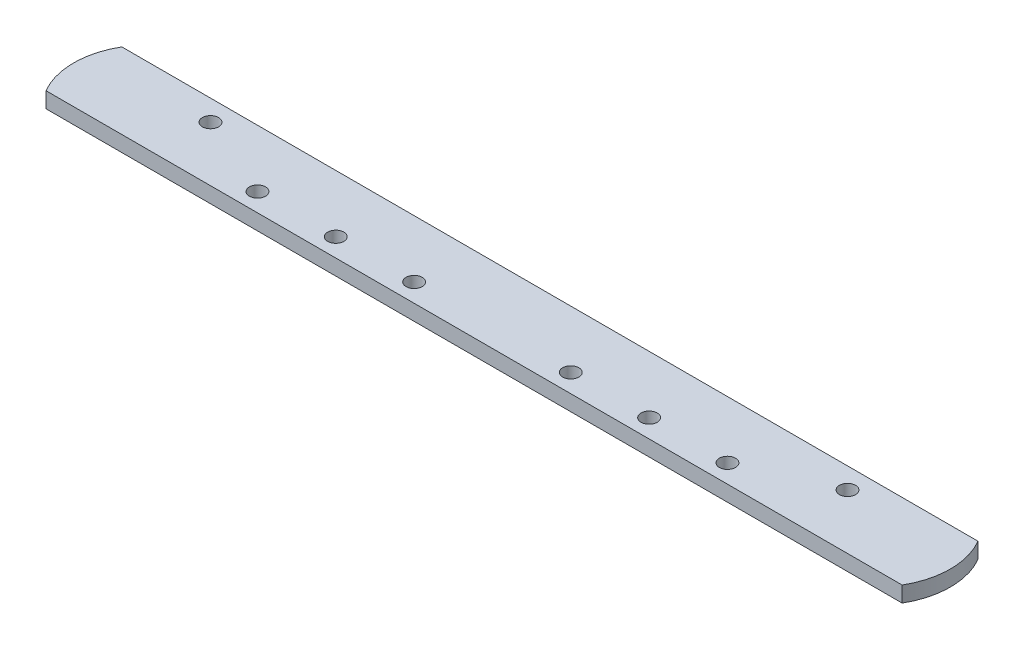
ISO-10303-21;
HEADER;
FILE_DESCRIPTION(('STEP AP214'),'2;1');
FILE_NAME('part.step','',(''),(''),'','','');
FILE_SCHEMA(('AUTOMOTIVE_DESIGN { 1 0 10303 214 1 1 1 1 }'));
ENDSEC;
DATA;
#1=APPLICATION_CONTEXT('core data for automotive mechanical design processes');
#2=APPLICATION_PROTOCOL_DEFINITION('international standard','automotive_design',2000,#1);
#3=PRODUCT_CONTEXT('',#1,'mechanical');
#4=PRODUCT('Part','Part','',(#3));
#5=PRODUCT_RELATED_PRODUCT_CATEGORY('part','',(#4));
#6=PRODUCT_DEFINITION_FORMATION('','',#4);
#7=PRODUCT_DEFINITION_CONTEXT('part definition',#1,'design');
#8=PRODUCT_DEFINITION('design','',#6,#7);
#9=PRODUCT_DEFINITION_SHAPE('','',#8);
#10=(LENGTH_UNIT() NAMED_UNIT(*) SI_UNIT(.MILLI.,.METRE.));
#11=(NAMED_UNIT(*) PLANE_ANGLE_UNIT() SI_UNIT($,.RADIAN.));
#12=(NAMED_UNIT(*) SI_UNIT($,.STERADIAN.) SOLID_ANGLE_UNIT());
#13=UNCERTAINTY_MEASURE_WITH_UNIT(LENGTH_MEASURE(1.E-05),#10,'distance_accuracy_value','');
#14=(GEOMETRIC_REPRESENTATION_CONTEXT(3) GLOBAL_UNCERTAINTY_ASSIGNED_CONTEXT((#13)) GLOBAL_UNIT_ASSIGNED_CONTEXT((#10,
#11,#12)) REPRESENTATION_CONTEXT('',''));
#15=CARTESIAN_POINT('',(0.,0.,0.));
#16=DIRECTION('',(0.,0.,1.));
#17=DIRECTION('',(1.,0.,0.));
#18=AXIS2_PLACEMENT_3D('',#15,#16,#17);
#19=CARTESIAN_POINT('',(-69.8674785281242,3.,-0.133913791833529));
#20=DIRECTION('',(0.,1.,0.));
#21=DIRECTION('',(0.,0.,1.));
#22=AXIS2_PLACEMENT_3D('',#19,#20,#21);
#23=PLANE('',#22);
#24=CARTESIAN_POINT('',(29.7225158493542,3.,3.60033580579458));
#25=DIRECTION('',(0.,1.,0.));
#26=DIRECTION('',(0.,0.,1.));
#27=AXIS2_PLACEMENT_3D('',#24,#25,#26);
#28=CIRCLE('',#27,1.55);
#29=CARTESIAN_POINT('',(29.7225158493542,3.,5.15033580579458));
#30=VERTEX_POINT('',#29);
#31=EDGE_CURVE('E151',#30,#30,#28,.T.);
#32=ORIENTED_EDGE('',*,*,#31,.F.);
#33=EDGE_LOOP('',(#32));
#34=FACE_BOUND('',#33,.T.);
#35=CARTESIAN_POINT('',(-45.2774841506459,3.,3.60033580579555));
#36=DIRECTION('',(0.,1.,0.));
#37=DIRECTION('',(0.,0.,1.));
#38=AXIS2_PLACEMENT_3D('',#35,#36,#37);
#39=CIRCLE('',#38,1.55);
#40=CARTESIAN_POINT('',(-45.2774841506459,3.,5.15033580579555));
#41=VERTEX_POINT('',#40);
#42=EDGE_CURVE('E139',#41,#41,#39,.T.);
#43=ORIENTED_EDGE('',*,*,#42,.F.);
#44=EDGE_LOOP('',(#43));
#45=FACE_BOUND('',#44,.T.);
#46=CARTESIAN_POINT('',(14.7225158493542,3.,3.60033580579572));
#47=DIRECTION('',(0.,1.,0.));
#48=DIRECTION('',(0.,0.,1.));
#49=AXIS2_PLACEMENT_3D('',#46,#47,#48);
#50=CIRCLE('',#49,1.55);
#51=CARTESIAN_POINT('',(14.7225158493542,3.,5.15033580579572));
#52=VERTEX_POINT('',#51);
#53=EDGE_CURVE('E127',#52,#52,#50,.T.);
#54=ORIENTED_EDGE('',*,*,#53,.F.);
#55=EDGE_LOOP('',(#54));
#56=FACE_BOUND('',#55,.T.);
#57=CARTESIAN_POINT('',(-61.2774841506458,3.,-3.39966419420429));
#58=DIRECTION('',(0.,1.,0.));
#59=DIRECTION('',(0.,0.,1.));
#60=AXIS2_PLACEMENT_3D('',#57,#58,#59);
#61=CIRCLE('',#60,1.55);
#62=CARTESIAN_POINT('',(-61.2774841506458,3.,-1.84966419420429));
#63=VERTEX_POINT('',#62);
#64=EDGE_CURVE('E106',#63,#63,#61,.T.);
#65=ORIENTED_EDGE('',*,*,#64,.F.);
#66=EDGE_LOOP('',(#65));
#67=FACE_BOUND('',#66,.T.);
#68=CARTESIAN_POINT('',(-69.8674785281242,3.,-0.133913791833529));
#69=DIRECTION('',(0.,1.,0.));
#70=DIRECTION('',(0.,0.,1.));
#71=AXIS2_PLACEMENT_3D('',#68,#69,#70);
#72=CIRCLE('',#71,14.3552574405959);
#73=CARTESIAN_POINT('',(-82.2482009333893,3.,-7.39966419420429));
#74=VERTEX_POINT('',#73);
#75=CARTESIAN_POINT('',(-82.2482009333893,3.,7.13183661053718));
#76=VERTEX_POINT('',#75);
#77=EDGE_CURVE('E91',#74,#76,#72,.T.);
#78=ORIENTED_EDGE('',*,*,#77,.T.);
#79=DIRECTION('',(1.,0.,0.));
#80=VECTOR('',#79,1.);
#81=CARTESIAN_POINT('',(81.7125457660552,3.,7.13183661053718));
#82=LINE('',#81,#80);
#83=CARTESIAN_POINT('',(81.7125457660552,3.,7.13183661053718));
#84=VERTEX_POINT('',#83);
#85=EDGE_CURVE('E86',#76,#84,#82,.T.);
#86=ORIENTED_EDGE('',*,*,#85,.T.);
#87=CARTESIAN_POINT('',(69.3318233607901,3.,-0.133913791833529));
#88=DIRECTION('',(0.,1.,0.));
#89=DIRECTION('',(0.,0.,-1.));
#90=AXIS2_PLACEMENT_3D('',#87,#88,#89);
#91=CIRCLE('',#90,14.3552574405959);
#92=CARTESIAN_POINT('',(81.7125457660552,3.,-7.39966419420429));
#93=VERTEX_POINT('',#92);
#94=EDGE_CURVE('E89',#84,#93,#91,.T.);
#95=ORIENTED_EDGE('',*,*,#94,.T.);
#96=DIRECTION('',(-1.,0.,0.));
#97=VECTOR('',#96,1.);
#98=CARTESIAN_POINT('',(-82.2482009333893,3.,-7.39966419420429));
#99=LINE('',#98,#97);
#100=EDGE_CURVE('E56',#93,#74,#99,.T.);
#101=ORIENTED_EDGE('',*,*,#100,.T.);
#102=EDGE_LOOP('',(#78,#86,#95,#101));
#103=FACE_BOUND('',#102,.T.);
#104=CARTESIAN_POINT('',(-15.2774841506458,3.,3.60033580579572));
#105=DIRECTION('',(0.,1.,0.));
#106=DIRECTION('',(0.,0.,1.));
#107=AXIS2_PLACEMENT_3D('',#104,#105,#106);
#108=CIRCLE('',#107,1.55000000000003);
#109=CARTESIAN_POINT('',(-15.2774841506458,3.,5.15033580579575));
#110=VERTEX_POINT('',#109);
#111=EDGE_CURVE('E121',#110,#110,#108,.T.);
#112=ORIENTED_EDGE('',*,*,#111,.F.);
#113=EDGE_LOOP('',(#112));
#114=FACE_BOUND('',#113,.T.);
#115=CARTESIAN_POINT('',(60.7225158493542,3.,-3.39966419420429));
#116=DIRECTION('',(0.,1.,0.));
#117=DIRECTION('',(0.,0.,1.));
#118=AXIS2_PLACEMENT_3D('',#115,#116,#117);
#119=CIRCLE('',#118,1.55);
#120=CARTESIAN_POINT('',(60.7225158493542,3.,-1.84966419420429));
#121=VERTEX_POINT('',#120);
#122=EDGE_CURVE('E133',#121,#121,#119,.T.);
#123=ORIENTED_EDGE('',*,*,#122,.F.);
#124=EDGE_LOOP('',(#123));
#125=FACE_BOUND('',#124,.T.);
#126=CARTESIAN_POINT('',(-30.2774841506458,3.,3.60033580579454));
#127=DIRECTION('',(0.,1.,0.));
#128=DIRECTION('',(0.,0.,1.));
#129=AXIS2_PLACEMENT_3D('',#126,#127,#128);
#130=CIRCLE('',#129,1.55);
#131=CARTESIAN_POINT('',(-30.2774841506458,3.,5.15033580579454));
#132=VERTEX_POINT('',#131);
#133=EDGE_CURVE('E145',#132,#132,#130,.T.);
#134=ORIENTED_EDGE('',*,*,#133,.F.);
#135=EDGE_LOOP('',(#134));
#136=FACE_BOUND('',#135,.T.);
#137=CARTESIAN_POINT('',(44.7225158493541,3.,3.60033580579577));
#138=DIRECTION('',(0.,1.,0.));
#139=DIRECTION('',(0.,0.,1.));
#140=AXIS2_PLACEMENT_3D('',#137,#138,#139);
#141=CIRCLE('',#140,1.55000000000009);
#142=CARTESIAN_POINT('',(44.7225158493541,3.,5.15033580579586));
#143=VERTEX_POINT('',#142);
#144=EDGE_CURVE('E157',#143,#143,#141,.T.);
#145=ORIENTED_EDGE('',*,*,#144,.F.);
#146=EDGE_LOOP('',(#145));
#147=FACE_BOUND('',#146,.T.);
#148=ADVANCED_FACE('F39',(#34,#45,#56,#67,#103,#114,#125,#136,#147),#23,.T.);
#149=CARTESIAN_POINT('',(-69.8674785281242,0.,-0.133913791833529));
#150=DIRECTION('',(0.,1.,0.));
#151=DIRECTION('',(0.,0.,1.));
#152=AXIS2_PLACEMENT_3D('',#149,#150,#151);
#153=PLANE('',#152);
#154=CARTESIAN_POINT('',(-69.8674785281242,0.,-0.133913791833529));
#155=DIRECTION('',(0.,1.,0.));
#156=DIRECTION('',(0.,0.,1.));
#157=AXIS2_PLACEMENT_3D('',#154,#155,#156);
#158=CIRCLE('',#157,14.3552574405959);
#159=CARTESIAN_POINT('',(-82.2482009333893,0.,-7.39966419420429));
#160=VERTEX_POINT('',#159);
#161=CARTESIAN_POINT('',(-82.2482009333893,0.,7.13183661053718));
#162=VERTEX_POINT('',#161);
#163=EDGE_CURVE('E103',#160,#162,#158,.T.);
#164=ORIENTED_EDGE('',*,*,#163,.F.);
#165=DIRECTION('',(-1.,0.,0.));
#166=VECTOR('',#165,1.);
#167=CARTESIAN_POINT('',(-82.2482009333893,0.,-7.39966419420429));
#168=LINE('',#167,#166);
#169=CARTESIAN_POINT('',(81.7125457660552,0.,-7.39966419420429));
#170=VERTEX_POINT('',#169);
#171=EDGE_CURVE('E79',#170,#160,#168,.T.);
#172=ORIENTED_EDGE('',*,*,#171,.F.);
#173=CARTESIAN_POINT('',(69.3318233607901,0.,-0.133913791833529));
#174=DIRECTION('',(0.,1.,0.));
#175=DIRECTION('',(0.,0.,-1.));
#176=AXIS2_PLACEMENT_3D('',#173,#174,#175);
#177=CIRCLE('',#176,14.3552574405959);
#178=CARTESIAN_POINT('',(81.7125457660552,0.,7.13183661053718));
#179=VERTEX_POINT('',#178);
#180=EDGE_CURVE('E73',#179,#170,#177,.T.);
#181=ORIENTED_EDGE('',*,*,#180,.F.);
#182=DIRECTION('',(1.,0.,0.));
#183=VECTOR('',#182,1.);
#184=CARTESIAN_POINT('',(81.7125457660552,0.,7.13183661053718));
#185=LINE('',#184,#183);
#186=EDGE_CURVE('E95',#162,#179,#185,.T.);
#187=ORIENTED_EDGE('',*,*,#186,.F.);
#188=EDGE_LOOP('',(#164,#172,#181,#187));
#189=FACE_BOUND('',#188,.T.);
#190=CARTESIAN_POINT('',(-61.2774841506458,0.,-3.39966419420429));
#191=DIRECTION('',(0.,1.,0.));
#192=DIRECTION('',(0.,0.,1.));
#193=AXIS2_PLACEMENT_3D('',#190,#191,#192);
#194=CIRCLE('',#193,1.55);
#195=CARTESIAN_POINT('',(-61.2774841506458,0.,-1.84966419420429));
#196=VERTEX_POINT('',#195);
#197=EDGE_CURVE('E118',#196,#196,#194,.T.);
#198=ORIENTED_EDGE('',*,*,#197,.T.);
#199=EDGE_LOOP('',(#198));
#200=FACE_BOUND('',#199,.T.);
#201=CARTESIAN_POINT('',(-15.2774841506458,0.,3.60033580579572));
#202=DIRECTION('',(0.,1.,0.));
#203=DIRECTION('',(0.,0.,1.));
#204=AXIS2_PLACEMENT_3D('',#201,#202,#203);
#205=CIRCLE('',#204,1.55000000000003);
#206=CARTESIAN_POINT('',(-15.2774841506458,0.,5.15033580579575));
#207=VERTEX_POINT('',#206);
#208=EDGE_CURVE('E124',#207,#207,#205,.T.);
#209=ORIENTED_EDGE('',*,*,#208,.T.);
#210=EDGE_LOOP('',(#209));
#211=FACE_BOUND('',#210,.T.);
#212=CARTESIAN_POINT('',(14.7225158493542,0.,3.60033580579572));
#213=DIRECTION('',(0.,1.,0.));
#214=DIRECTION('',(0.,0.,1.));
#215=AXIS2_PLACEMENT_3D('',#212,#213,#214);
#216=CIRCLE('',#215,1.55);
#217=CARTESIAN_POINT('',(14.7225158493542,0.,5.15033580579572));
#218=VERTEX_POINT('',#217);
#219=EDGE_CURVE('E130',#218,#218,#216,.T.);
#220=ORIENTED_EDGE('',*,*,#219,.T.);
#221=EDGE_LOOP('',(#220));
#222=FACE_BOUND('',#221,.T.);
#223=CARTESIAN_POINT('',(60.7225158493542,0.,-3.39966419420429));
#224=DIRECTION('',(0.,1.,0.));
#225=DIRECTION('',(0.,0.,1.));
#226=AXIS2_PLACEMENT_3D('',#223,#224,#225);
#227=CIRCLE('',#226,1.55);
#228=CARTESIAN_POINT('',(60.7225158493542,0.,-1.84966419420429));
#229=VERTEX_POINT('',#228);
#230=EDGE_CURVE('E136',#229,#229,#227,.T.);
#231=ORIENTED_EDGE('',*,*,#230,.T.);
#232=EDGE_LOOP('',(#231));
#233=FACE_BOUND('',#232,.T.);
#234=CARTESIAN_POINT('',(-45.2774841506459,0.,3.60033580579555));
#235=DIRECTION('',(0.,1.,0.));
#236=DIRECTION('',(0.,0.,1.));
#237=AXIS2_PLACEMENT_3D('',#234,#235,#236);
#238=CIRCLE('',#237,1.55);
#239=CARTESIAN_POINT('',(-45.2774841506459,0.,5.15033580579555));
#240=VERTEX_POINT('',#239);
#241=EDGE_CURVE('E142',#240,#240,#238,.T.);
#242=ORIENTED_EDGE('',*,*,#241,.T.);
#243=EDGE_LOOP('',(#242));
#244=FACE_BOUND('',#243,.T.);
#245=CARTESIAN_POINT('',(-30.2774841506458,0.,3.60033580579454));
#246=DIRECTION('',(0.,1.,0.));
#247=DIRECTION('',(0.,0.,1.));
#248=AXIS2_PLACEMENT_3D('',#245,#246,#247);
#249=CIRCLE('',#248,1.55);
#250=CARTESIAN_POINT('',(-30.2774841506458,0.,5.15033580579454));
#251=VERTEX_POINT('',#250);
#252=EDGE_CURVE('E148',#251,#251,#249,.T.);
#253=ORIENTED_EDGE('',*,*,#252,.T.);
#254=EDGE_LOOP('',(#253));
#255=FACE_BOUND('',#254,.T.);
#256=CARTESIAN_POINT('',(29.7225158493542,0.,3.60033580579458));
#257=DIRECTION('',(0.,1.,0.));
#258=DIRECTION('',(0.,0.,1.));
#259=AXIS2_PLACEMENT_3D('',#256,#257,#258);
#260=CIRCLE('',#259,1.55);
#261=CARTESIAN_POINT('',(29.7225158493542,0.,5.15033580579458));
#262=VERTEX_POINT('',#261);
#263=EDGE_CURVE('E154',#262,#262,#260,.T.);
#264=ORIENTED_EDGE('',*,*,#263,.T.);
#265=EDGE_LOOP('',(#264));
#266=FACE_BOUND('',#265,.T.);
#267=CARTESIAN_POINT('',(44.7225158493541,0.,3.60033580579577));
#268=DIRECTION('',(0.,1.,0.));
#269=DIRECTION('',(0.,0.,1.));
#270=AXIS2_PLACEMENT_3D('',#267,#268,#269);
#271=CIRCLE('',#270,1.55000000000009);
#272=CARTESIAN_POINT('',(44.7225158493541,0.,5.15033580579586));
#273=VERTEX_POINT('',#272);
#274=EDGE_CURVE('E160',#273,#273,#271,.T.);
#275=ORIENTED_EDGE('',*,*,#274,.T.);
#276=EDGE_LOOP('',(#275));
#277=FACE_BOUND('',#276,.T.);
#278=ADVANCED_FACE('F114',(#189,#200,#211,#222,#233,#244,#255,#266,#277),#153,.F.);
#279=CARTESIAN_POINT('',(-69.8674785281242,3.,-0.133913791833529));
#280=DIRECTION('',(0.,-1.,0.));
#281=DIRECTION('',(0.,0.,-1.));
#282=AXIS2_PLACEMENT_3D('',#279,#280,#281);
#283=CYLINDRICAL_SURFACE('',#282,14.3552574405959);
#284=ORIENTED_EDGE('',*,*,#163,.T.);
#285=DIRECTION('',(0.,-1.,0.));
#286=VECTOR('',#285,1.);
#287=CARTESIAN_POINT('',(-82.2482009333893,3.,7.13183661053718));
#288=LINE('',#287,#286);
#289=EDGE_CURVE('E11',#76,#162,#288,.T.);
#290=ORIENTED_EDGE('',*,*,#289,.F.);
#291=ORIENTED_EDGE('',*,*,#77,.F.);
#292=DIRECTION('',(0.,-1.,0.));
#293=VECTOR('',#292,1.);
#294=CARTESIAN_POINT('',(-82.2482009333893,3.,-7.39966419420429));
#295=LINE('',#294,#293);
#296=EDGE_CURVE('E99',#74,#160,#295,.T.);
#297=ORIENTED_EDGE('',*,*,#296,.T.);
#298=EDGE_LOOP('',(#284,#290,#291,#297));
#299=FACE_BOUND('',#298,.T.);
#300=ADVANCED_FACE('F41',(#299),#283,.T.);
#301=CARTESIAN_POINT('',(81.7125457660552,3.,7.13183661053718));
#302=DIRECTION('',(0.,0.,-1.));
#303=DIRECTION('',(-1.,0.,0.));
#304=AXIS2_PLACEMENT_3D('',#301,#302,#303);
#305=PLANE('',#304);
#306=ORIENTED_EDGE('',*,*,#186,.T.);
#307=DIRECTION('',(0.,-1.,0.));
#308=VECTOR('',#307,1.);
#309=CARTESIAN_POINT('',(81.7125457660552,3.,7.13183661053718));
#310=LINE('',#309,#308);
#311=EDGE_CURVE('E48',#84,#179,#310,.T.);
#312=ORIENTED_EDGE('',*,*,#311,.F.);
#313=ORIENTED_EDGE('',*,*,#85,.F.);
#314=ORIENTED_EDGE('',*,*,#289,.T.);
#315=EDGE_LOOP('',(#306,#312,#313,#314));
#316=FACE_BOUND('',#315,.T.);
#317=ADVANCED_FACE('F94',(#316),#305,.F.);
#318=CARTESIAN_POINT('',(69.3318233607901,3.,-0.133913791833529));
#319=DIRECTION('',(0.,-1.,0.));
#320=DIRECTION('',(0.,0.,-1.));
#321=AXIS2_PLACEMENT_3D('',#318,#319,#320);
#322=CYLINDRICAL_SURFACE('',#321,14.3552574405959);
#323=ORIENTED_EDGE('',*,*,#180,.T.);
#324=DIRECTION('',(0.,-1.,0.));
#325=VECTOR('',#324,1.);
#326=CARTESIAN_POINT('',(81.7125457660552,3.,-7.39966419420429));
#327=LINE('',#326,#325);
#328=EDGE_CURVE('E96',#93,#170,#327,.T.);
#329=ORIENTED_EDGE('',*,*,#328,.F.);
#330=ORIENTED_EDGE('',*,*,#94,.F.);
#331=ORIENTED_EDGE('',*,*,#311,.T.);
#332=EDGE_LOOP('',(#323,#329,#330,#331));
#333=FACE_BOUND('',#332,.T.);
#334=ADVANCED_FACE('F97',(#333),#322,.T.);
#335=CARTESIAN_POINT('',(-82.2482009333893,3.,-7.39966419420429));
#336=DIRECTION('',(0.,0.,1.));
#337=DIRECTION('',(1.,0.,0.));
#338=AXIS2_PLACEMENT_3D('',#335,#336,#337);
#339=PLANE('',#338);
#340=ORIENTED_EDGE('',*,*,#171,.T.);
#341=ORIENTED_EDGE('',*,*,#296,.F.);
#342=ORIENTED_EDGE('',*,*,#100,.F.);
#343=ORIENTED_EDGE('',*,*,#328,.T.);
#344=EDGE_LOOP('',(#340,#341,#342,#343));
#345=FACE_BOUND('',#344,.T.);
#346=ADVANCED_FACE('F111',(#345),#339,.F.);
#347=CARTESIAN_POINT('',(-61.2774841506458,3.,-3.39966419420429));
#348=DIRECTION('',(0.,-1.,0.));
#349=DIRECTION('',(0.,0.,-1.));
#350=AXIS2_PLACEMENT_3D('',#347,#348,#349);
#351=CYLINDRICAL_SURFACE('',#350,1.55);
#352=ORIENTED_EDGE('',*,*,#64,.T.);
#353=EDGE_LOOP('',(#352));
#354=FACE_BOUND('',#353,.T.);
#355=ORIENTED_EDGE('',*,*,#197,.F.);
#356=EDGE_LOOP('',(#355));
#357=FACE_BOUND('',#356,.T.);
#358=ADVANCED_FACE('F179',(#354,#357),#351,.F.);
#359=CARTESIAN_POINT('',(-15.2774841506458,3.,3.60033580579572));
#360=DIRECTION('',(0.,-1.,0.));
#361=DIRECTION('',(0.,0.,-1.));
#362=AXIS2_PLACEMENT_3D('',#359,#360,#361);
#363=CYLINDRICAL_SURFACE('',#362,1.55000000000003);
#364=ORIENTED_EDGE('',*,*,#111,.T.);
#365=EDGE_LOOP('',(#364));
#366=FACE_BOUND('',#365,.T.);
#367=ORIENTED_EDGE('',*,*,#208,.F.);
#368=EDGE_LOOP('',(#367));
#369=FACE_BOUND('',#368,.T.);
#370=ADVANCED_FACE('F233',(#366,#369),#363,.F.);
#371=CARTESIAN_POINT('',(14.7225158493542,3.,3.60033580579572));
#372=DIRECTION('',(0.,-1.,0.));
#373=DIRECTION('',(0.,0.,-1.));
#374=AXIS2_PLACEMENT_3D('',#371,#372,#373);
#375=CYLINDRICAL_SURFACE('',#374,1.55);
#376=ORIENTED_EDGE('',*,*,#53,.T.);
#377=EDGE_LOOP('',(#376));
#378=FACE_BOUND('',#377,.T.);
#379=ORIENTED_EDGE('',*,*,#219,.F.);
#380=EDGE_LOOP('',(#379));
#381=FACE_BOUND('',#380,.T.);
#382=ADVANCED_FACE('F242',(#378,#381),#375,.F.);
#383=CARTESIAN_POINT('',(60.7225158493542,3.,-3.39966419420429));
#384=DIRECTION('',(0.,-1.,0.));
#385=DIRECTION('',(0.,0.,-1.));
#386=AXIS2_PLACEMENT_3D('',#383,#384,#385);
#387=CYLINDRICAL_SURFACE('',#386,1.55);
#388=ORIENTED_EDGE('',*,*,#122,.T.);
#389=EDGE_LOOP('',(#388));
#390=FACE_BOUND('',#389,.T.);
#391=ORIENTED_EDGE('',*,*,#230,.F.);
#392=EDGE_LOOP('',(#391));
#393=FACE_BOUND('',#392,.T.);
#394=ADVANCED_FACE('F251',(#390,#393),#387,.F.);
#395=CARTESIAN_POINT('',(-45.2774841506459,3.,3.60033580579555));
#396=DIRECTION('',(0.,-1.,0.));
#397=DIRECTION('',(0.,0.,-1.));
#398=AXIS2_PLACEMENT_3D('',#395,#396,#397);
#399=CYLINDRICAL_SURFACE('',#398,1.55);
#400=ORIENTED_EDGE('',*,*,#42,.T.);
#401=EDGE_LOOP('',(#400));
#402=FACE_BOUND('',#401,.T.);
#403=ORIENTED_EDGE('',*,*,#241,.F.);
#404=EDGE_LOOP('',(#403));
#405=FACE_BOUND('',#404,.T.);
#406=ADVANCED_FACE('F261',(#402,#405),#399,.F.);
#407=CARTESIAN_POINT('',(-30.2774841506458,3.,3.60033580579454));
#408=DIRECTION('',(0.,-1.,0.));
#409=DIRECTION('',(0.,0.,-1.));
#410=AXIS2_PLACEMENT_3D('',#407,#408,#409);
#411=CYLINDRICAL_SURFACE('',#410,1.55);
#412=ORIENTED_EDGE('',*,*,#133,.T.);
#413=EDGE_LOOP('',(#412));
#414=FACE_BOUND('',#413,.T.);
#415=ORIENTED_EDGE('',*,*,#252,.F.);
#416=EDGE_LOOP('',(#415));
#417=FACE_BOUND('',#416,.T.);
#418=ADVANCED_FACE('F271',(#414,#417),#411,.F.);
#419=CARTESIAN_POINT('',(29.7225158493542,3.,3.60033580579458));
#420=DIRECTION('',(0.,-1.,0.));
#421=DIRECTION('',(0.,0.,-1.));
#422=AXIS2_PLACEMENT_3D('',#419,#420,#421);
#423=CYLINDRICAL_SURFACE('',#422,1.55);
#424=ORIENTED_EDGE('',*,*,#31,.T.);
#425=EDGE_LOOP('',(#424));
#426=FACE_BOUND('',#425,.T.);
#427=ORIENTED_EDGE('',*,*,#263,.F.);
#428=EDGE_LOOP('',(#427));
#429=FACE_BOUND('',#428,.T.);
#430=ADVANCED_FACE('F281',(#426,#429),#423,.F.);
#431=CARTESIAN_POINT('',(44.7225158493541,3.,3.60033580579577));
#432=DIRECTION('',(0.,-1.,0.));
#433=DIRECTION('',(0.,0.,-1.));
#434=AXIS2_PLACEMENT_3D('',#431,#432,#433);
#435=CYLINDRICAL_SURFACE('',#434,1.55000000000009);
#436=ORIENTED_EDGE('',*,*,#144,.T.);
#437=EDGE_LOOP('',(#436));
#438=FACE_BOUND('',#437,.T.);
#439=ORIENTED_EDGE('',*,*,#274,.F.);
#440=EDGE_LOOP('',(#439));
#441=FACE_BOUND('',#440,.T.);
#442=ADVANCED_FACE('F166',(#438,#441),#435,.F.);
#443=CLOSED_SHELL('',(#148,#278,#300,#317,#334,#346,#358,#370,#382,#394,#406,#418,#430,#442));
#444=MANIFOLD_SOLID_BREP('B2',#443);
#445=ADVANCED_BREP_SHAPE_REPRESENTATION('',(#18,#444),#14);
#446=SHAPE_DEFINITION_REPRESENTATION(#9,#445);
ENDSEC;
END-ISO-10303-21;
